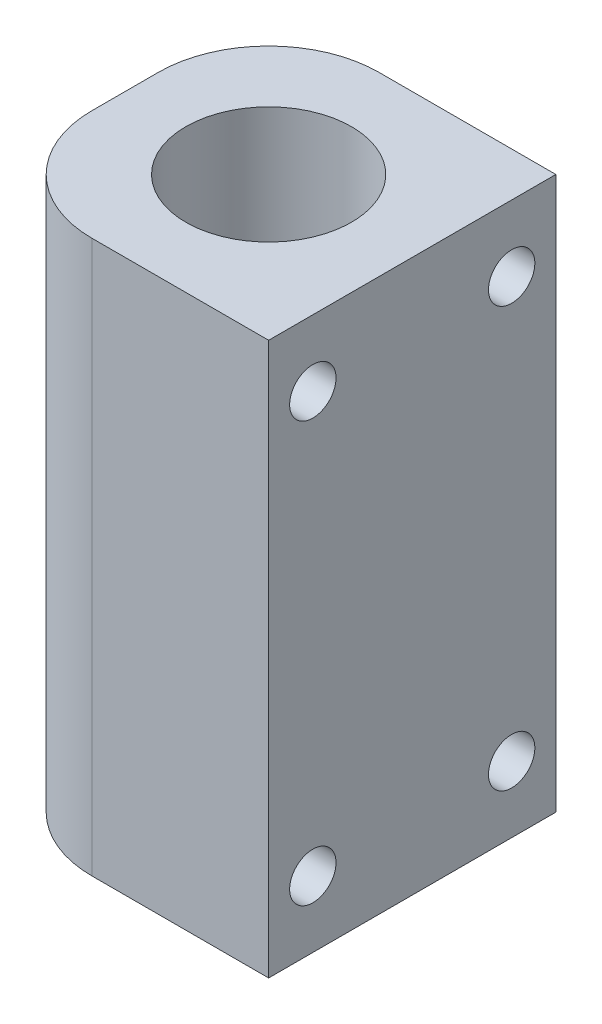
ISO-10303-21;
HEADER;
FILE_DESCRIPTION(('STEP AP214'),'2;1');
FILE_NAME('part.step','',(''),(''),'','','');
FILE_SCHEMA(('AUTOMOTIVE_DESIGN { 1 0 10303 214 1 1 1 1 }'));
ENDSEC;
DATA;
#1=APPLICATION_CONTEXT('core data for automotive mechanical design processes');
#2=APPLICATION_PROTOCOL_DEFINITION('international standard','automotive_design',2000,#1);
#3=PRODUCT_CONTEXT('',#1,'mechanical');
#4=PRODUCT('Part','Part','',(#3));
#5=PRODUCT_RELATED_PRODUCT_CATEGORY('part','',(#4));
#6=PRODUCT_DEFINITION_FORMATION('','',#4);
#7=PRODUCT_DEFINITION_CONTEXT('part definition',#1,'design');
#8=PRODUCT_DEFINITION('design','',#6,#7);
#9=PRODUCT_DEFINITION_SHAPE('','',#8);
#10=(LENGTH_UNIT() NAMED_UNIT(*) SI_UNIT(.MILLI.,.METRE.));
#11=(NAMED_UNIT(*) PLANE_ANGLE_UNIT() SI_UNIT($,.RADIAN.));
#12=(NAMED_UNIT(*) SI_UNIT($,.STERADIAN.) SOLID_ANGLE_UNIT());
#13=UNCERTAINTY_MEASURE_WITH_UNIT(LENGTH_MEASURE(1.E-05),#10,'distance_accuracy_value','');
#14=(GEOMETRIC_REPRESENTATION_CONTEXT(3) GLOBAL_UNCERTAINTY_ASSIGNED_CONTEXT((#13)) GLOBAL_UNIT_ASSIGNED_CONTEXT((#10,
#11,#12)) REPRESENTATION_CONTEXT('',''));
#15=CARTESIAN_POINT('',(0.,0.,0.));
#16=DIRECTION('',(0.,0.,1.));
#17=DIRECTION('',(1.,0.,0.));
#18=AXIS2_PLACEMENT_3D('',#15,#16,#17);
#19=CARTESIAN_POINT('',(-13.,-25.,26.));
#20=DIRECTION('',(1.,0.,0.));
#21=DIRECTION('',(0.,0.,-1.));
#22=AXIS2_PLACEMENT_3D('',#19,#20,#21);
#23=PLANE('',#22);
#24=DIRECTION('',(0.,0.,-1.));
#25=VECTOR('',#24,1.);
#26=CARTESIAN_POINT('',(-13.,25.,26.));
#27=LINE('',#26,#25);
#28=CARTESIAN_POINT('',(-13.,25.,16.));
#29=VERTEX_POINT('',#28);
#30=CARTESIAN_POINT('',(-13.,25.,10.));
#31=VERTEX_POINT('',#30);
#32=EDGE_CURVE('E155',#29,#31,#27,.T.);
#33=ORIENTED_EDGE('',*,*,#32,.T.);
#34=DIRECTION('',(0.,-1.,0.));
#35=VECTOR('',#34,1.);
#36=CARTESIAN_POINT('',(-13.,-25.,10.));
#37=LINE('',#36,#35);
#38=CARTESIAN_POINT('',(-13.,-25.,10.));
#39=VERTEX_POINT('',#38);
#40=EDGE_CURVE('E173',#31,#39,#37,.T.);
#41=ORIENTED_EDGE('',*,*,#40,.T.);
#42=DIRECTION('',(0.,0.,-1.));
#43=VECTOR('',#42,1.);
#44=CARTESIAN_POINT('',(-13.,-25.,26.));
#45=LINE('',#44,#43);
#46=CARTESIAN_POINT('',(-13.,-25.,16.));
#47=VERTEX_POINT('',#46);
#48=EDGE_CURVE('E168',#47,#39,#45,.T.);
#49=ORIENTED_EDGE('',*,*,#48,.F.);
#50=DIRECTION('',(0.,-1.,0.));
#51=VECTOR('',#50,1.);
#52=CARTESIAN_POINT('',(-13.,25.,16.));
#53=LINE('',#52,#51);
#54=EDGE_CURVE('E171',#47,#29,#53,.F.);
#55=ORIENTED_EDGE('',*,*,#54,.T.);
#56=EDGE_LOOP('',(#33,#41,#49,#55));
#57=FACE_BOUND('',#56,.T.);
#58=ADVANCED_FACE('F41',(#57),#23,.F.);
#59=CARTESIAN_POINT('',(13.,-25.,26.));
#60=DIRECTION('',(0.,1.,0.));
#61=DIRECTION('',(-1.,0.,0.));
#62=AXIS2_PLACEMENT_3D('',#59,#60,#61);
#63=PLANE('',#62);
#64=CARTESIAN_POINT('',(0.,-25.,13.));
#65=DIRECTION('',(0.,1.,0.));
#66=DIRECTION('',(-1.,0.,0.));
#67=AXIS2_PLACEMENT_3D('',#64,#65,#66);
#68=CIRCLE('',#67,7.5);
#69=CARTESIAN_POINT('',(-7.49999999999999,-25.,13.));
#70=VERTEX_POINT('',#69);
#71=EDGE_CURVE('E142',#70,#70,#68,.T.);
#72=ORIENTED_EDGE('',*,*,#71,.T.);
#73=EDGE_LOOP('',(#72));
#74=FACE_BOUND('',#73,.T.);
#75=ORIENTED_EDGE('',*,*,#48,.T.);
#76=CARTESIAN_POINT('',(-3.,-25.,10.));
#77=DIRECTION('',(0.,1.,0.));
#78=DIRECTION('',(-1.,0.,0.));
#79=AXIS2_PLACEMENT_3D('',#76,#77,#78);
#80=CIRCLE('',#79,10.);
#81=CARTESIAN_POINT('',(-2.99999999999999,-25.,0.));
#82=VERTEX_POINT('',#81);
#83=EDGE_CURVE('E178',#39,#82,#80,.F.);
#84=ORIENTED_EDGE('',*,*,#83,.T.);
#85=DIRECTION('',(1.,0.,0.));
#86=VECTOR('',#85,1.);
#87=CARTESIAN_POINT('',(13.,-25.,0.));
#88=LINE('',#87,#86);
#89=CARTESIAN_POINT('',(13.,-25.,0.));
#90=VERTEX_POINT('',#89);
#91=EDGE_CURVE('E145',#82,#90,#88,.T.);
#92=ORIENTED_EDGE('',*,*,#91,.T.);
#93=DIRECTION('',(0.,0.,-1.));
#94=VECTOR('',#93,1.);
#95=CARTESIAN_POINT('',(13.,-25.,26.));
#96=LINE('',#95,#94);
#97=CARTESIAN_POINT('',(13.,-25.,26.));
#98=VERTEX_POINT('',#97);
#99=EDGE_CURVE('E165',#98,#90,#96,.T.);
#100=ORIENTED_EDGE('',*,*,#99,.F.);
#101=DIRECTION('',(1.,0.,0.));
#102=VECTOR('',#101,1.);
#103=CARTESIAN_POINT('',(13.,-25.,26.));
#104=LINE('',#103,#102);
#105=CARTESIAN_POINT('',(-2.99999999999999,-25.,26.));
#106=VERTEX_POINT('',#105);
#107=EDGE_CURVE('E148',#106,#98,#104,.T.);
#108=ORIENTED_EDGE('',*,*,#107,.F.);
#109=CARTESIAN_POINT('',(-3.,-25.,16.));
#110=DIRECTION('',(0.,1.,0.));
#111=DIRECTION('',(-1.,0.,0.));
#112=AXIS2_PLACEMENT_3D('',#109,#110,#111);
#113=CIRCLE('',#112,10.);
#114=EDGE_CURVE('E176',#106,#47,#113,.F.);
#115=ORIENTED_EDGE('',*,*,#114,.T.);
#116=EDGE_LOOP('',(#75,#84,#92,#100,#108,#115));
#117=FACE_BOUND('',#116,.T.);
#118=ADVANCED_FACE('F190',(#74,#117),#63,.F.);
#119=CARTESIAN_POINT('',(13.,-25.,26.));
#120=DIRECTION('',(-1.,0.,0.));
#121=DIRECTION('',(0.,0.,1.));
#122=AXIS2_PLACEMENT_3D('',#119,#120,#121);
#123=PLANE('',#122);
#124=CARTESIAN_POINT('',(13.,19.,22.));
#125=DIRECTION('',(1.,0.,0.));
#126=DIRECTION('',(0.,0.,-1.));
#127=AXIS2_PLACEMENT_3D('',#124,#125,#126);
#128=CIRCLE('',#127,2.1);
#129=CARTESIAN_POINT('',(13.,19.,19.9));
#130=VERTEX_POINT('',#129);
#131=EDGE_CURVE('E119',#130,#130,#128,.T.);
#132=ORIENTED_EDGE('',*,*,#131,.F.);
#133=EDGE_LOOP('',(#132));
#134=FACE_BOUND('',#133,.T.);
#135=CARTESIAN_POINT('',(13.,19.,4.));
#136=DIRECTION('',(1.,0.,0.));
#137=DIRECTION('',(0.,0.,-1.));
#138=AXIS2_PLACEMENT_3D('',#135,#136,#137);
#139=CIRCLE('',#138,2.1);
#140=CARTESIAN_POINT('',(13.,19.,1.9));
#141=VERTEX_POINT('',#140);
#142=EDGE_CURVE('E118',#141,#141,#139,.T.);
#143=ORIENTED_EDGE('',*,*,#142,.F.);
#144=EDGE_LOOP('',(#143));
#145=FACE_BOUND('',#144,.T.);
#146=CARTESIAN_POINT('',(13.,-19.,22.));
#147=DIRECTION('',(1.,0.,0.));
#148=DIRECTION('',(0.,0.,-1.));
#149=AXIS2_PLACEMENT_3D('',#146,#147,#148);
#150=CIRCLE('',#149,2.1);
#151=CARTESIAN_POINT('',(13.,-19.,19.9));
#152=VERTEX_POINT('',#151);
#153=EDGE_CURVE('E129',#152,#152,#150,.T.);
#154=ORIENTED_EDGE('',*,*,#153,.F.);
#155=EDGE_LOOP('',(#154));
#156=FACE_BOUND('',#155,.T.);
#157=CARTESIAN_POINT('',(13.,-19.,4.));
#158=DIRECTION('',(1.,0.,0.));
#159=DIRECTION('',(0.,0.,-1.));
#160=AXIS2_PLACEMENT_3D('',#157,#158,#159);
#161=CIRCLE('',#160,2.1);
#162=CARTESIAN_POINT('',(13.,-19.,1.9));
#163=VERTEX_POINT('',#162);
#164=EDGE_CURVE('E135',#163,#163,#161,.T.);
#165=ORIENTED_EDGE('',*,*,#164,.F.);
#166=EDGE_LOOP('',(#165));
#167=FACE_BOUND('',#166,.T.);
#168=DIRECTION('',(0.,1.,0.));
#169=VECTOR('',#168,1.);
#170=CARTESIAN_POINT('',(13.,-25.,0.));
#171=LINE('',#170,#169);
#172=CARTESIAN_POINT('',(13.,25.,0.));
#173=VERTEX_POINT('',#172);
#174=EDGE_CURVE('E157',#90,#173,#171,.T.);
#175=ORIENTED_EDGE('',*,*,#174,.T.);
#176=DIRECTION('',(0.,0.,-1.));
#177=VECTOR('',#176,1.);
#178=CARTESIAN_POINT('',(13.,25.,26.));
#179=LINE('',#178,#177);
#180=CARTESIAN_POINT('',(13.,25.,26.));
#181=VERTEX_POINT('',#180);
#182=EDGE_CURVE('E162',#181,#173,#179,.T.);
#183=ORIENTED_EDGE('',*,*,#182,.F.);
#184=DIRECTION('',(0.,1.,0.));
#185=VECTOR('',#184,1.);
#186=CARTESIAN_POINT('',(13.,-25.,26.));
#187=LINE('',#186,#185);
#188=EDGE_CURVE('E150',#98,#181,#187,.T.);
#189=ORIENTED_EDGE('',*,*,#188,.F.);
#190=ORIENTED_EDGE('',*,*,#99,.T.);
#191=EDGE_LOOP('',(#175,#183,#189,#190));
#192=FACE_BOUND('',#191,.T.);
#193=ADVANCED_FACE('F196',(#134,#145,#156,#167,#192),#123,.F.);
#194=CARTESIAN_POINT('',(13.,25.,26.));
#195=DIRECTION('',(0.,-1.,0.));
#196=DIRECTION('',(1.,0.,0.));
#197=AXIS2_PLACEMENT_3D('',#194,#195,#196);
#198=PLANE('',#197);
#199=CARTESIAN_POINT('',(0.,25.,13.));
#200=DIRECTION('',(0.,1.,0.));
#201=DIRECTION('',(-1.,0.,0.));
#202=AXIS2_PLACEMENT_3D('',#199,#200,#201);
#203=CIRCLE('',#202,7.5);
#204=CARTESIAN_POINT('',(-7.5,25.,13.));
#205=VERTEX_POINT('',#204);
#206=EDGE_CURVE('E141',#205,#205,#203,.T.);
#207=ORIENTED_EDGE('',*,*,#206,.F.);
#208=EDGE_LOOP('',(#207));
#209=FACE_BOUND('',#208,.T.);
#210=DIRECTION('',(-1.,0.,0.));
#211=VECTOR('',#210,1.);
#212=CARTESIAN_POINT('',(13.,25.,0.));
#213=LINE('',#212,#211);
#214=CARTESIAN_POINT('',(-2.99999999999999,25.,0.));
#215=VERTEX_POINT('',#214);
#216=EDGE_CURVE('E151',#173,#215,#213,.T.);
#217=ORIENTED_EDGE('',*,*,#216,.T.);
#218=CARTESIAN_POINT('',(-3.,25.,10.));
#219=DIRECTION('',(0.,-1.,0.));
#220=DIRECTION('',(1.,0.,0.));
#221=AXIS2_PLACEMENT_3D('',#218,#219,#220);
#222=CIRCLE('',#221,10.);
#223=EDGE_CURVE('E49',#215,#31,#222,.F.);
#224=ORIENTED_EDGE('',*,*,#223,.T.);
#225=ORIENTED_EDGE('',*,*,#32,.F.);
#226=CARTESIAN_POINT('',(-3.,25.,16.));
#227=DIRECTION('',(0.,-1.,0.));
#228=DIRECTION('',(1.,0.,0.));
#229=AXIS2_PLACEMENT_3D('',#226,#227,#228);
#230=CIRCLE('',#229,10.);
#231=CARTESIAN_POINT('',(-2.99999999999999,25.,26.));
#232=VERTEX_POINT('',#231);
#233=EDGE_CURVE('E56',#29,#232,#230,.F.);
#234=ORIENTED_EDGE('',*,*,#233,.T.);
#235=DIRECTION('',(-1.,0.,0.));
#236=VECTOR('',#235,1.);
#237=CARTESIAN_POINT('',(13.,25.,26.));
#238=LINE('',#237,#236);
#239=EDGE_CURVE('E153',#181,#232,#238,.T.);
#240=ORIENTED_EDGE('',*,*,#239,.F.);
#241=ORIENTED_EDGE('',*,*,#182,.T.);
#242=EDGE_LOOP('',(#217,#224,#225,#234,#240,#241));
#243=FACE_BOUND('',#242,.T.);
#244=ADVANCED_FACE('F182',(#209,#243),#198,.F.);
#245=CARTESIAN_POINT('',(0.,0.,26.));
#246=DIRECTION('',(0.,0.,1.));
#247=DIRECTION('',(1.,0.,0.));
#248=AXIS2_PLACEMENT_3D('',#245,#246,#247);
#249=PLANE('',#248);
#250=ORIENTED_EDGE('',*,*,#239,.T.);
#251=DIRECTION('',(0.,-1.,0.));
#252=VECTOR('',#251,1.);
#253=CARTESIAN_POINT('',(-3.,-25.,26.));
#254=LINE('',#253,#252);
#255=EDGE_CURVE('E11',#232,#106,#254,.T.);
#256=ORIENTED_EDGE('',*,*,#255,.T.);
#257=ORIENTED_EDGE('',*,*,#107,.T.);
#258=ORIENTED_EDGE('',*,*,#188,.T.);
#259=EDGE_LOOP('',(#250,#256,#257,#258));
#260=FACE_BOUND('',#259,.T.);
#261=ADVANCED_FACE('F200',(#260),#249,.T.);
#262=CARTESIAN_POINT('',(0.,0.,0.));
#263=DIRECTION('',(0.,0.,1.));
#264=DIRECTION('',(1.,0.,0.));
#265=AXIS2_PLACEMENT_3D('',#262,#263,#264);
#266=PLANE('',#265);
#267=ORIENTED_EDGE('',*,*,#91,.F.);
#268=DIRECTION('',(0.,-1.,0.));
#269=VECTOR('',#268,1.);
#270=CARTESIAN_POINT('',(-3.,0.,0.));
#271=LINE('',#270,#269);
#272=EDGE_CURVE('E64',#82,#215,#271,.F.);
#273=ORIENTED_EDGE('',*,*,#272,.T.);
#274=ORIENTED_EDGE('',*,*,#216,.F.);
#275=ORIENTED_EDGE('',*,*,#174,.F.);
#276=EDGE_LOOP('',(#267,#273,#274,#275));
#277=FACE_BOUND('',#276,.T.);
#278=ADVANCED_FACE('F193',(#277),#266,.F.);
#279=CARTESIAN_POINT('',(-3.,-25.,10.));
#280=DIRECTION('',(0.,-1.,0.));
#281=DIRECTION('',(0.,0.,-1.));
#282=AXIS2_PLACEMENT_3D('',#279,#280,#281);
#283=CYLINDRICAL_SURFACE('',#282,10.);
#284=ORIENTED_EDGE('',*,*,#223,.F.);
#285=ORIENTED_EDGE('',*,*,#272,.F.);
#286=ORIENTED_EDGE('',*,*,#83,.F.);
#287=ORIENTED_EDGE('',*,*,#40,.F.);
#288=EDGE_LOOP('',(#284,#285,#286,#287));
#289=FACE_BOUND('',#288,.T.);
#290=ADVANCED_FACE('F188',(#289),#283,.T.);
#291=CARTESIAN_POINT('',(-3.,0.,16.));
#292=DIRECTION('',(0.,1.,0.));
#293=DIRECTION('',(0.,0.,1.));
#294=AXIS2_PLACEMENT_3D('',#291,#292,#293);
#295=CYLINDRICAL_SURFACE('',#294,10.);
#296=ORIENTED_EDGE('',*,*,#233,.F.);
#297=ORIENTED_EDGE('',*,*,#54,.F.);
#298=ORIENTED_EDGE('',*,*,#114,.F.);
#299=ORIENTED_EDGE('',*,*,#255,.F.);
#300=EDGE_LOOP('',(#296,#297,#298,#299));
#301=FACE_BOUND('',#300,.T.);
#302=ADVANCED_FACE('F43',(#301),#295,.T.);
#303=CARTESIAN_POINT('',(0.,-25.,13.));
#304=DIRECTION('',(0.,1.,0.));
#305=DIRECTION('',(-1.,0.,0.));
#306=AXIS2_PLACEMENT_3D('',#303,#304,#305);
#307=CYLINDRICAL_SURFACE('',#306,7.5);
#308=ORIENTED_EDGE('',*,*,#71,.F.);
#309=EDGE_LOOP('',(#308));
#310=FACE_BOUND('',#309,.T.);
#311=ORIENTED_EDGE('',*,*,#206,.T.);
#312=EDGE_LOOP('',(#311));
#313=FACE_BOUND('',#312,.T.);
#314=ADVANCED_FACE('F204',(#310,#313),#307,.F.);
#315=CARTESIAN_POINT('',(4.,-19.,4.));
#316=DIRECTION('',(1.,0.,0.));
#317=DIRECTION('',(0.,0.,-1.));
#318=AXIS2_PLACEMENT_3D('',#315,#316,#317);
#319=CONICAL_SURFACE('',#318,2.1,1.02974425867665);
#320=CARTESIAN_POINT('',(2.73819270004213,-19.,4.));
#321=VERTEX_POINT('',#320);
#322=VERTEX_LOOP('',#321);
#323=FACE_BOUND('',#322,.T.);
#324=CARTESIAN_POINT('',(4.,-19.,4.));
#325=DIRECTION('',(1.,0.,0.));
#326=DIRECTION('',(0.,0.,-1.));
#327=AXIS2_PLACEMENT_3D('',#324,#325,#326);
#328=CIRCLE('',#327,2.1);
#329=CARTESIAN_POINT('',(4.,-19.,1.90000000000001));
#330=VERTEX_POINT('',#329);
#331=EDGE_CURVE('E138',#330,#330,#328,.T.);
#332=ORIENTED_EDGE('',*,*,#331,.T.);
#333=EDGE_LOOP('',(#332));
#334=FACE_BOUND('',#333,.T.);
#335=ADVANCED_FACE('F209',(#323,#334),#319,.F.);
#336=CARTESIAN_POINT('',(13.,-19.,4.));
#337=DIRECTION('',(1.,0.,0.));
#338=DIRECTION('',(0.,0.,-1.));
#339=AXIS2_PLACEMENT_3D('',#336,#337,#338);
#340=CYLINDRICAL_SURFACE('',#339,2.1);
#341=ORIENTED_EDGE('',*,*,#331,.F.);
#342=EDGE_LOOP('',(#341));
#343=FACE_BOUND('',#342,.T.);
#344=ORIENTED_EDGE('',*,*,#164,.T.);
#345=EDGE_LOOP('',(#344));
#346=FACE_BOUND('',#345,.T.);
#347=ADVANCED_FACE('F232',(#343,#346),#340,.F.);
#348=CARTESIAN_POINT('',(4.,-19.,22.));
#349=DIRECTION('',(1.,0.,0.));
#350=DIRECTION('',(0.,0.,-1.));
#351=AXIS2_PLACEMENT_3D('',#348,#349,#350);
#352=CONICAL_SURFACE('',#351,2.1,1.02974425867665);
#353=CARTESIAN_POINT('',(2.73819270004213,-19.,22.));
#354=VERTEX_POINT('',#353);
#355=VERTEX_LOOP('',#354);
#356=FACE_BOUND('',#355,.T.);
#357=CARTESIAN_POINT('',(4.,-19.,22.));
#358=DIRECTION('',(1.,0.,0.));
#359=DIRECTION('',(0.,0.,-1.));
#360=AXIS2_PLACEMENT_3D('',#357,#358,#359);
#361=CIRCLE('',#360,2.1);
#362=CARTESIAN_POINT('',(4.,-19.,19.9));
#363=VERTEX_POINT('',#362);
#364=EDGE_CURVE('E132',#363,#363,#361,.T.);
#365=ORIENTED_EDGE('',*,*,#364,.T.);
#366=EDGE_LOOP('',(#365));
#367=FACE_BOUND('',#366,.T.);
#368=ADVANCED_FACE('F236',(#356,#367),#352,.F.);
#369=CARTESIAN_POINT('',(13.,-19.,22.));
#370=DIRECTION('',(1.,0.,0.));
#371=DIRECTION('',(0.,0.,-1.));
#372=AXIS2_PLACEMENT_3D('',#369,#370,#371);
#373=CYLINDRICAL_SURFACE('',#372,2.1);
#374=ORIENTED_EDGE('',*,*,#364,.F.);
#375=EDGE_LOOP('',(#374));
#376=FACE_BOUND('',#375,.T.);
#377=ORIENTED_EDGE('',*,*,#153,.T.);
#378=EDGE_LOOP('',(#377));
#379=FACE_BOUND('',#378,.T.);
#380=ADVANCED_FACE('F240',(#376,#379),#373,.F.);
#381=CARTESIAN_POINT('',(4.,19.,4.));
#382=DIRECTION('',(1.,0.,0.));
#383=DIRECTION('',(0.,0.,-1.));
#384=AXIS2_PLACEMENT_3D('',#381,#382,#383);
#385=CONICAL_SURFACE('',#384,2.1,1.02974425867665);
#386=CARTESIAN_POINT('',(2.73819270004213,19.,4.));
#387=VERTEX_POINT('',#386);
#388=VERTEX_LOOP('',#387);
#389=FACE_BOUND('',#388,.T.);
#390=CARTESIAN_POINT('',(4.,19.,4.));
#391=DIRECTION('',(1.,0.,0.));
#392=DIRECTION('',(0.,0.,-1.));
#393=AXIS2_PLACEMENT_3D('',#390,#391,#392);
#394=CIRCLE('',#393,2.1);
#395=CARTESIAN_POINT('',(4.,19.,1.90000000000001));
#396=VERTEX_POINT('',#395);
#397=EDGE_CURVE('E122',#396,#396,#394,.T.);
#398=ORIENTED_EDGE('',*,*,#397,.T.);
#399=EDGE_LOOP('',(#398));
#400=FACE_BOUND('',#399,.T.);
#401=ADVANCED_FACE('F244',(#389,#400),#385,.F.);
#402=CARTESIAN_POINT('',(13.,19.,4.));
#403=DIRECTION('',(1.,0.,0.));
#404=DIRECTION('',(0.,0.,-1.));
#405=AXIS2_PLACEMENT_3D('',#402,#403,#404);
#406=CYLINDRICAL_SURFACE('',#405,2.1);
#407=ORIENTED_EDGE('',*,*,#397,.F.);
#408=EDGE_LOOP('',(#407));
#409=FACE_BOUND('',#408,.T.);
#410=ORIENTED_EDGE('',*,*,#142,.T.);
#411=EDGE_LOOP('',(#410));
#412=FACE_BOUND('',#411,.T.);
#413=ADVANCED_FACE('F112',(#409,#412),#406,.F.);
#414=CARTESIAN_POINT('',(4.,19.,22.));
#415=DIRECTION('',(1.,0.,0.));
#416=DIRECTION('',(0.,0.,-1.));
#417=AXIS2_PLACEMENT_3D('',#414,#415,#416);
#418=CONICAL_SURFACE('',#417,2.1,1.02974425867665);
#419=CARTESIAN_POINT('',(2.73819270004213,19.,22.));
#420=VERTEX_POINT('',#419);
#421=VERTEX_LOOP('',#420);
#422=FACE_BOUND('',#421,.T.);
#423=CARTESIAN_POINT('',(4.,19.,22.));
#424=DIRECTION('',(1.,0.,0.));
#425=DIRECTION('',(0.,0.,-1.));
#426=AXIS2_PLACEMENT_3D('',#423,#424,#425);
#427=CIRCLE('',#426,2.1);
#428=CARTESIAN_POINT('',(4.,19.,19.9));
#429=VERTEX_POINT('',#428);
#430=EDGE_CURVE('E116',#429,#429,#427,.T.);
#431=ORIENTED_EDGE('',*,*,#430,.T.);
#432=EDGE_LOOP('',(#431));
#433=FACE_BOUND('',#432,.T.);
#434=ADVANCED_FACE('F108',(#422,#433),#418,.F.);
#435=CARTESIAN_POINT('',(13.,19.,22.));
#436=DIRECTION('',(1.,0.,0.));
#437=DIRECTION('',(0.,0.,-1.));
#438=AXIS2_PLACEMENT_3D('',#435,#436,#437);
#439=CYLINDRICAL_SURFACE('',#438,2.1);
#440=ORIENTED_EDGE('',*,*,#430,.F.);
#441=EDGE_LOOP('',(#440));
#442=FACE_BOUND('',#441,.T.);
#443=ORIENTED_EDGE('',*,*,#131,.T.);
#444=EDGE_LOOP('',(#443));
#445=FACE_BOUND('',#444,.T.);
#446=ADVANCED_FACE('F111',(#442,#445),#439,.F.);
#447=CLOSED_SHELL('',(#58,#118,#193,#244,#261,#278,#290,#302,#314,#335,#347,#368,#380,#401,#413,
#434,#446));
#448=MANIFOLD_SOLID_BREP('B2',#447);
#449=ADVANCED_BREP_SHAPE_REPRESENTATION('',(#18,#448),#14);
#450=SHAPE_DEFINITION_REPRESENTATION(#9,#449);
ENDSEC;
END-ISO-10303-21;
